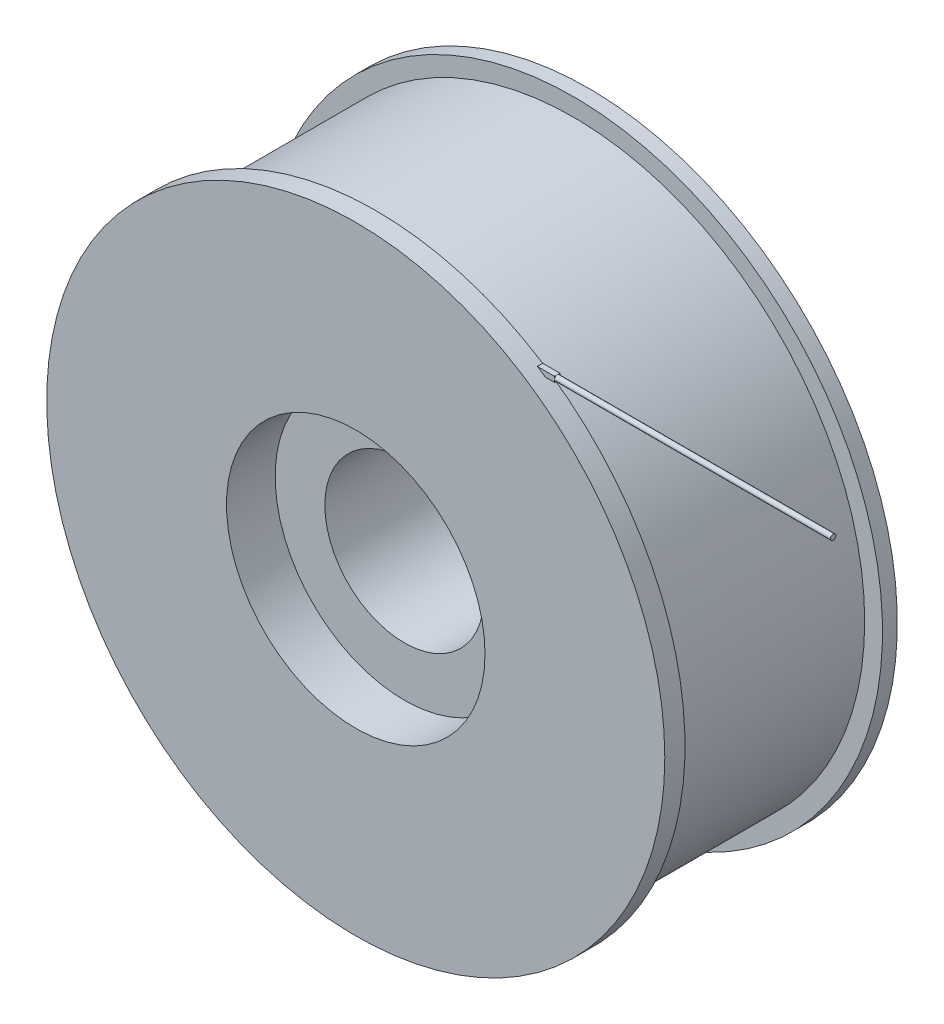
ISO-10303-21;
HEADER;
FILE_DESCRIPTION(('STEP AP214'),'2;1');
FILE_NAME('part.step','',(''),(''),'','','');
FILE_SCHEMA(('AUTOMOTIVE_DESIGN { 1 0 10303 214 1 1 1 1 }'));
ENDSEC;
DATA;
#1=APPLICATION_CONTEXT('core data for automotive mechanical design processes');
#2=APPLICATION_PROTOCOL_DEFINITION('international standard','automotive_design',2000,#1);
#3=PRODUCT_CONTEXT('',#1,'mechanical');
#4=PRODUCT('Part','Part','',(#3));
#5=PRODUCT_RELATED_PRODUCT_CATEGORY('part','',(#4));
#6=PRODUCT_DEFINITION_FORMATION('','',#4);
#7=PRODUCT_DEFINITION_CONTEXT('part definition',#1,'design');
#8=PRODUCT_DEFINITION('design','',#6,#7);
#9=PRODUCT_DEFINITION_SHAPE('','',#8);
#10=(LENGTH_UNIT() NAMED_UNIT(*) SI_UNIT(.MILLI.,.METRE.));
#11=(NAMED_UNIT(*) PLANE_ANGLE_UNIT() SI_UNIT($,.RADIAN.));
#12=(NAMED_UNIT(*) SI_UNIT($,.STERADIAN.) SOLID_ANGLE_UNIT());
#13=UNCERTAINTY_MEASURE_WITH_UNIT(LENGTH_MEASURE(1.E-05),#10,'distance_accuracy_value','');
#14=(GEOMETRIC_REPRESENTATION_CONTEXT(3) GLOBAL_UNCERTAINTY_ASSIGNED_CONTEXT((#13)) GLOBAL_UNIT_ASSIGNED_CONTEXT((#10,
#11,#12)) REPRESENTATION_CONTEXT('',''));
#15=CARTESIAN_POINT('',(0.,0.,0.));
#16=DIRECTION('',(0.,0.,1.));
#17=DIRECTION('',(1.,0.,0.));
#18=AXIS2_PLACEMENT_3D('',#15,#16,#17);
#19=CARTESIAN_POINT('',(-236.379864015801,83.12,69.26));
#20=DIRECTION('',(0.,-1.,0.));
#21=DIRECTION('',(0.,0.,-1.));
#22=AXIS2_PLACEMENT_3D('',#19,#20,#21);
#23=PLANE('',#22);
#24=DIRECTION('',(1.,0.,0.));
#25=VECTOR('',#24,1.);
#26=CARTESIAN_POINT('',(-236.379864015801,83.12,69.26));
#27=LINE('',#26,#25);
#28=CARTESIAN_POINT('',(57.0237283944149,83.12,69.26));
#29=VERTEX_POINT('',#28);
#30=CARTESIAN_POINT('',(60.0000000000001,83.12,69.26));
#31=VERTEX_POINT('',#30);
#32=EDGE_CURVE('E124',#29,#31,#27,.T.);
#33=ORIENTED_EDGE('',*,*,#32,.T.);
#34=DIRECTION('',(0.,0.,1.));
#35=VECTOR('',#34,1.);
#36=CARTESIAN_POINT('',(60.0000000000001,83.12,69.26));
#37=LINE('',#36,#35);
#38=CARTESIAN_POINT('',(60.,83.12,70.135));
#39=VERTEX_POINT('',#38);
#40=EDGE_CURVE('E148',#31,#39,#37,.T.);
#41=ORIENTED_EDGE('',*,*,#40,.T.);
#42=CARTESIAN_POINT('',(60.0000000000001,83.12,71.01));
#43=VERTEX_POINT('',#42);
#44=EDGE_CURVE('E140',#39,#43,#37,.T.);
#45=ORIENTED_EDGE('',*,*,#44,.T.);
#46=DIRECTION('',(1.,0.,0.));
#47=VECTOR('',#46,1.);
#48=CARTESIAN_POINT('',(-236.379864015801,83.12,71.01));
#49=LINE('',#48,#47);
#50=CARTESIAN_POINT('',(57.0237283944149,83.12,71.01));
#51=VERTEX_POINT('',#50);
#52=EDGE_CURVE('E128',#51,#43,#49,.T.);
#53=ORIENTED_EDGE('',*,*,#52,.F.);
#54=DIRECTION('',(0.,0.,1.));
#55=VECTOR('',#54,1.);
#56=CARTESIAN_POINT('',(57.0237283944149,83.12,69.26));
#57=LINE('',#56,#55);
#58=EDGE_CURVE('E115',#29,#51,#57,.T.);
#59=ORIENTED_EDGE('',*,*,#58,.F.);
#60=EDGE_LOOP('',(#33,#41,#45,#53,#59));
#61=FACE_BOUND('',#60,.T.);
#62=ADVANCED_FACE('F71',(#61),#23,.T.);
#63=CARTESIAN_POINT('',(-236.379864015801,84.87,69.26));
#64=DIRECTION('',(0.,-1.,0.));
#65=DIRECTION('',(0.,0.,-1.));
#66=AXIS2_PLACEMENT_3D('',#63,#64,#65);
#67=PLANE('',#66);
#68=DIRECTION('',(0.,0.,1.));
#69=VECTOR('',#68,1.);
#70=CARTESIAN_POINT('',(60.0000000000001,84.87,69.26));
#71=LINE('',#70,#69);
#72=CARTESIAN_POINT('',(60.0000000000001,84.87,69.26));
#73=VERTEX_POINT('',#72);
#74=CARTESIAN_POINT('',(60.,84.87,70.135));
#75=VERTEX_POINT('',#74);
#76=EDGE_CURVE('E149',#73,#75,#71,.T.);
#77=ORIENTED_EDGE('',*,*,#76,.F.);
#78=DIRECTION('',(1.,0.,0.));
#79=VECTOR('',#78,1.);
#80=CARTESIAN_POINT('',(-236.379864015801,84.87,69.26));
#81=LINE('',#80,#79);
#82=CARTESIAN_POINT('',(54.3849528822082,84.87,69.26));
#83=VERTEX_POINT('',#82);
#84=EDGE_CURVE('E113',#83,#73,#81,.T.);
#85=ORIENTED_EDGE('',*,*,#84,.F.);
#86=DIRECTION('',(0.,0.,1.));
#87=VECTOR('',#86,1.);
#88=CARTESIAN_POINT('',(54.3849528822082,84.87,69.26));
#89=LINE('',#88,#87);
#90=CARTESIAN_POINT('',(54.3849528822082,84.87,71.01));
#91=VERTEX_POINT('',#90);
#92=EDGE_CURVE('E94',#83,#91,#89,.T.);
#93=ORIENTED_EDGE('',*,*,#92,.T.);
#94=DIRECTION('',(1.,0.,0.));
#95=VECTOR('',#94,1.);
#96=CARTESIAN_POINT('',(-236.379864015801,84.87,71.01));
#97=LINE('',#96,#95);
#98=CARTESIAN_POINT('',(60.0000000000001,84.87,71.01));
#99=VERTEX_POINT('',#98);
#100=EDGE_CURVE('E111',#91,#99,#97,.T.);
#101=ORIENTED_EDGE('',*,*,#100,.T.);
#102=EDGE_CURVE('E153',#75,#99,#71,.T.);
#103=ORIENTED_EDGE('',*,*,#102,.F.);
#104=EDGE_LOOP('',(#77,#85,#93,#101,#103));
#105=FACE_BOUND('',#104,.T.);
#106=ADVANCED_FACE('F108',(#105),#67,.F.);
#107=CARTESIAN_POINT('',(-236.379864015801,10.8271208898592,69.26));
#108=DIRECTION('',(0.,0.,-1.));
#109=DIRECTION('',(-1.,0.,0.));
#110=AXIS2_PLACEMENT_3D('',#107,#108,#109);
#111=PLANE('',#110);
#112=ORIENTED_EDGE('',*,*,#84,.T.);
#113=DIRECTION('',(0.,-1.,0.));
#114=VECTOR('',#113,1.);
#115=CARTESIAN_POINT('',(60.0000000000001,10.8271208898592,69.26));
#116=LINE('',#115,#114);
#117=CARTESIAN_POINT('',(60.,83.995,69.26));
#118=VERTEX_POINT('',#117);
#119=EDGE_CURVE('E130',#73,#118,#116,.T.);
#120=ORIENTED_EDGE('',*,*,#119,.T.);
#121=EDGE_CURVE('E151',#118,#31,#116,.T.);
#122=ORIENTED_EDGE('',*,*,#121,.T.);
#123=ORIENTED_EDGE('',*,*,#32,.F.);
#124=CARTESIAN_POINT('',(0.,0.,69.26));
#125=DIRECTION('',(0.,0.,-1.));
#126=DIRECTION('',(-1.,0.,0.));
#127=AXIS2_PLACEMENT_3D('',#124,#125,#126);
#128=CIRCLE('',#127,100.8);
#129=EDGE_CURVE('E160',#83,#29,#128,.T.);
#130=ORIENTED_EDGE('',*,*,#129,.F.);
#131=EDGE_LOOP('',(#112,#120,#122,#123,#130));
#132=FACE_BOUND('',#131,.T.);
#133=ADVANCED_FACE('F164',(#132),#111,.T.);
#134=CARTESIAN_POINT('',(-236.379864015801,10.8271208898592,71.01));
#135=DIRECTION('',(0.,0.,-1.));
#136=DIRECTION('',(-1.,0.,0.));
#137=AXIS2_PLACEMENT_3D('',#134,#135,#136);
#138=PLANE('',#137);
#139=DIRECTION('',(0.,-1.,0.));
#140=VECTOR('',#139,1.);
#141=CARTESIAN_POINT('',(60.0000000000001,10.8271208898592,71.01));
#142=LINE('',#141,#140);
#143=CARTESIAN_POINT('',(60.,83.995,71.01));
#144=VERTEX_POINT('',#143);
#145=EDGE_CURVE('E13',#99,#144,#142,.T.);
#146=ORIENTED_EDGE('',*,*,#145,.F.);
#147=ORIENTED_EDGE('',*,*,#100,.F.);
#148=CARTESIAN_POINT('',(0.,0.,71.01));
#149=DIRECTION('',(0.,0.,-1.));
#150=DIRECTION('',(-1.,0.,0.));
#151=AXIS2_PLACEMENT_3D('',#148,#149,#150);
#152=CIRCLE('',#151,100.8);
#153=EDGE_CURVE('E122',#91,#51,#152,.T.);
#154=ORIENTED_EDGE('',*,*,#153,.T.);
#155=ORIENTED_EDGE('',*,*,#52,.T.);
#156=EDGE_CURVE('E74',#144,#43,#142,.T.);
#157=ORIENTED_EDGE('',*,*,#156,.F.);
#158=EDGE_LOOP('',(#146,#147,#154,#155,#157));
#159=FACE_BOUND('',#158,.T.);
#160=ADVANCED_FACE('F120',(#159),#138,.F.);
#161=CARTESIAN_POINT('',(0.,0.,69.26));
#162=DIRECTION('',(0.,0.,1.));
#163=DIRECTION('',(1.,0.,0.));
#164=AXIS2_PLACEMENT_3D('',#161,#162,#163);
#165=CYLINDRICAL_SURFACE('',#164,100.8);
#166=ORIENTED_EDGE('',*,*,#153,.F.);
#167=ORIENTED_EDGE('',*,*,#92,.F.);
#168=ORIENTED_EDGE('',*,*,#129,.T.);
#169=ORIENTED_EDGE('',*,*,#58,.T.);
#170=EDGE_LOOP('',(#166,#167,#168,#169));
#171=FACE_BOUND('',#170,.T.);
#172=ADVANCED_FACE('F126',(#171),#165,.F.);
#173=CARTESIAN_POINT('',(60.,83.995,70.135));
#174=DIRECTION('',(1.,0.,0.));
#175=DIRECTION('',(0.,0.,-1.));
#176=AXIS2_PLACEMENT_3D('',#173,#174,#175);
#177=CYLINDRICAL_SURFACE('',#176,0.875000000000005);
#178=CARTESIAN_POINT('',(150.,83.995,70.135));
#179=DIRECTION('',(1.,0.,0.));
#180=DIRECTION('',(0.,0.,-1.));
#181=AXIS2_PLACEMENT_3D('',#178,#179,#180);
#182=CIRCLE('',#181,0.875000000000005);
#183=CARTESIAN_POINT('',(150.,83.995,69.26));
#184=VERTEX_POINT('',#183);
#185=EDGE_CURVE('E184',#184,#184,#182,.T.);
#186=ORIENTED_EDGE('',*,*,#185,.F.);
#187=EDGE_LOOP('',(#186));
#188=FACE_BOUND('',#187,.T.);
#189=CARTESIAN_POINT('',(60.,83.995,70.135));
#190=DIRECTION('',(1.,0.,0.));
#191=DIRECTION('',(0.,0.,-1.));
#192=AXIS2_PLACEMENT_3D('',#189,#190,#191);
#193=CIRCLE('',#192,0.875000000000005);
#194=EDGE_CURVE('E142',#144,#39,#193,.T.);
#195=ORIENTED_EDGE('',*,*,#194,.T.);
#196=EDGE_CURVE('E181',#39,#118,#193,.T.);
#197=ORIENTED_EDGE('',*,*,#196,.T.);
#198=EDGE_CURVE('E183',#118,#75,#193,.T.);
#199=ORIENTED_EDGE('',*,*,#198,.T.);
#200=EDGE_CURVE('E85',#75,#144,#193,.T.);
#201=ORIENTED_EDGE('',*,*,#200,.T.);
#202=EDGE_LOOP('',(#195,#197,#199,#201));
#203=FACE_BOUND('',#202,.T.);
#204=ADVANCED_FACE('F182',(#188,#203),#177,.T.);
#205=CARTESIAN_POINT('',(60.,83.995,67.845217101876));
#206=DIRECTION('',(1.,0.,0.));
#207=DIRECTION('',(0.,0.,-1.));
#208=AXIS2_PLACEMENT_3D('',#205,#206,#207);
#209=PLANE('',#208);
#210=ORIENTED_EDGE('',*,*,#76,.T.);
#211=ORIENTED_EDGE('',*,*,#198,.F.);
#212=ORIENTED_EDGE('',*,*,#119,.F.);
#213=EDGE_LOOP('',(#210,#211,#212));
#214=FACE_BOUND('',#213,.T.);
#215=ADVANCED_FACE('F186',(#214),#209,.T.);
#216=ORIENTED_EDGE('',*,*,#196,.F.);
#217=ORIENTED_EDGE('',*,*,#40,.F.);
#218=ORIENTED_EDGE('',*,*,#121,.F.);
#219=EDGE_LOOP('',(#216,#217,#218));
#220=FACE_BOUND('',#219,.T.);
#221=ADVANCED_FACE('F180',(#220),#209,.T.);
#222=ORIENTED_EDGE('',*,*,#102,.T.);
#223=ORIENTED_EDGE('',*,*,#145,.T.);
#224=ORIENTED_EDGE('',*,*,#200,.F.);
#225=EDGE_LOOP('',(#222,#223,#224));
#226=FACE_BOUND('',#225,.T.);
#227=ADVANCED_FACE('F253',(#226),#209,.T.);
#228=ORIENTED_EDGE('',*,*,#194,.F.);
#229=ORIENTED_EDGE('',*,*,#156,.T.);
#230=ORIENTED_EDGE('',*,*,#44,.F.);
#231=EDGE_LOOP('',(#228,#229,#230));
#232=FACE_BOUND('',#231,.T.);
#233=ADVANCED_FACE('F138',(#232),#209,.T.);
#234=CARTESIAN_POINT('',(150.,10.8271208898592,69.26));
#235=DIRECTION('',(-1.,0.,0.));
#236=DIRECTION('',(0.,0.,1.));
#237=AXIS2_PLACEMENT_3D('',#234,#235,#236);
#238=PLANE('',#237);
#239=ORIENTED_EDGE('',*,*,#185,.T.);
#240=EDGE_LOOP('',(#239));
#241=FACE_BOUND('',#240,.T.);
#242=ADVANCED_FACE('F190',(#241),#238,.F.);
#243=CLOSED_SHELL('',(#62,#106,#133,#160,#172,#204,#215,#221,#227,#233,#242));
#244=MANIFOLD_SOLID_BREP('B2',#243);
#245=CARTESIAN_POINT('',(0.,0.,71.01));
#246=DIRECTION('',(0.,0.,1.));
#247=DIRECTION('',(1.,0.,0.));
#248=AXIS2_PLACEMENT_3D('',#245,#246,#247);
#249=PLANE('',#248);
#250=DIRECTION('',(1.,0.,0.));
#251=VECTOR('',#250,1.);
#252=CARTESIAN_POINT('',(-236.379864015801,83.12,71.01));
#253=LINE('',#252,#251);
#254=CARTESIAN_POINT('',(46.0007130379519,83.12,71.01));
#255=VERTEX_POINT('',#254);
#256=CARTESIAN_POINT('',(57.0237283944149,83.12,71.01));
#257=VERTEX_POINT('',#256);
#258=EDGE_CURVE('E449',#255,#257,#253,.T.);
#259=ORIENTED_EDGE('',*,*,#258,.F.);
#260=CARTESIAN_POINT('',(0.,0.,71.01));
#261=DIRECTION('',(0.,0.,1.));
#262=DIRECTION('',(1.,0.,0.));
#263=AXIS2_PLACEMENT_3D('',#260,#261,#262);
#264=CIRCLE('',#263,95.);
#265=CARTESIAN_POINT('',(42.6858653420544,84.87,71.01));
#266=VERTEX_POINT('',#265);
#267=EDGE_CURVE('E69',#266,#255,#264,.F.);
#268=ORIENTED_EDGE('',*,*,#267,.F.);
#269=DIRECTION('',(1.,0.,0.));
#270=VECTOR('',#269,1.);
#271=CARTESIAN_POINT('',(-236.379864015801,84.87,71.01));
#272=LINE('',#271,#270);
#273=CARTESIAN_POINT('',(54.3849528822082,84.87,71.01));
#274=VERTEX_POINT('',#273);
#275=EDGE_CURVE('E372',#266,#274,#272,.T.);
#276=ORIENTED_EDGE('',*,*,#275,.T.);
#277=CARTESIAN_POINT('',(0.,0.,71.01));
#278=DIRECTION('',(0.,0.,1.));
#279=DIRECTION('',(1.,0.,0.));
#280=AXIS2_PLACEMENT_3D('',#277,#278,#279);
#281=CIRCLE('',#280,100.8);
#282=EDGE_CURVE('E411',#257,#274,#281,.T.);
#283=ORIENTED_EDGE('',*,*,#282,.F.);
#284=EDGE_LOOP('',(#259,#268,#276,#283));
#285=FACE_BOUND('',#284,.T.);
#286=ADVANCED_FACE('F333',(#285),#249,.F.);
#287=CARTESIAN_POINT('',(0.,0.,-263.860576850888));
#288=DIRECTION('',(0.,0.,1.));
#289=DIRECTION('',(1.,0.,0.));
#290=AXIS2_PLACEMENT_3D('',#287,#288,#289);
#291=CYLINDRICAL_SURFACE('',#290,95.);
#292=CARTESIAN_POINT('',(0.,0.,4.84000000000001));
#293=DIRECTION('',(0.,0.,1.));
#294=DIRECTION('',(1.,0.,0.));
#295=AXIS2_PLACEMENT_3D('',#292,#293,#294);
#296=CIRCLE('',#295,95.);
#297=CARTESIAN_POINT('',(95.,0.,4.84000000000001));
#298=VERTEX_POINT('',#297);
#299=EDGE_CURVE('E392',#298,#298,#296,.T.);
#300=ORIENTED_EDGE('',*,*,#299,.T.);
#301=EDGE_LOOP('',(#300));
#302=FACE_BOUND('',#301,.T.);
#303=DIRECTION('',(0.,0.,1.));
#304=VECTOR('',#303,1.);
#305=CARTESIAN_POINT('',(46.0007130379519,83.12,69.26));
#306=LINE('',#305,#304);
#307=CARTESIAN_POINT('',(46.0007130379519,83.12,69.26));
#308=VERTEX_POINT('',#307);
#309=EDGE_CURVE('E380',#308,#255,#306,.T.);
#310=ORIENTED_EDGE('',*,*,#309,.F.);
#311=CARTESIAN_POINT('',(0.,0.,69.26));
#312=DIRECTION('',(0.,0.,-1.));
#313=DIRECTION('',(-1.,0.,0.));
#314=AXIS2_PLACEMENT_3D('',#311,#312,#313);
#315=CIRCLE('',#314,95.);
#316=CARTESIAN_POINT('',(42.6858653420544,84.87,69.26));
#317=VERTEX_POINT('',#316);
#318=EDGE_CURVE('E384',#317,#308,#315,.F.);
#319=ORIENTED_EDGE('',*,*,#318,.F.);
#320=DIRECTION('',(0.,0.,1.));
#321=VECTOR('',#320,1.);
#322=CARTESIAN_POINT('',(42.6858653420544,84.87,69.26));
#323=LINE('',#322,#321);
#324=EDGE_CURVE('E454',#317,#266,#323,.T.);
#325=ORIENTED_EDGE('',*,*,#324,.T.);
#326=ORIENTED_EDGE('',*,*,#267,.T.);
#327=EDGE_LOOP('',(#310,#319,#325,#326));
#328=FACE_BOUND('',#327,.T.);
#329=ADVANCED_FACE('F390',(#302,#328),#291,.T.);
#330=CARTESIAN_POINT('',(0.,0.,4.84));
#331=DIRECTION('',(0.,0.,1.));
#332=DIRECTION('',(1.,0.,0.));
#333=AXIS2_PLACEMENT_3D('',#330,#331,#332);
#334=PLANE('',#333);
#335=CARTESIAN_POINT('',(0.,0.,4.84));
#336=DIRECTION('',(0.,0.,1.));
#337=DIRECTION('',(1.,0.,0.));
#338=AXIS2_PLACEMENT_3D('',#335,#336,#337);
#339=CIRCLE('',#338,100.8);
#340=CARTESIAN_POINT('',(-100.8,0.,4.84));
#341=VERTEX_POINT('',#340);
#342=EDGE_CURVE('E341',#341,#341,#339,.T.);
#343=ORIENTED_EDGE('',*,*,#342,.T.);
#344=EDGE_LOOP('',(#343));
#345=FACE_BOUND('',#344,.T.);
#346=ORIENTED_EDGE('',*,*,#299,.F.);
#347=EDGE_LOOP('',(#346));
#348=FACE_BOUND('',#347,.T.);
#349=ADVANCED_FACE('F472',(#345,#348),#334,.T.);
#350=CARTESIAN_POINT('',(0.,0.,4.84));
#351=DIRECTION('',(0.,0.,-1.));
#352=DIRECTION('',(-1.,0.,0.));
#353=AXIS2_PLACEMENT_3D('',#350,#351,#352);
#354=CYLINDRICAL_SURFACE('',#353,25.95);
#355=CARTESIAN_POINT('',(0.,0.,0.));
#356=DIRECTION('',(0.,0.,1.));
#357=DIRECTION('',(1.,0.,0.));
#358=AXIS2_PLACEMENT_3D('',#355,#356,#357);
#359=CIRCLE('',#358,25.95);
#360=CARTESIAN_POINT('',(-25.95,0.,0.));
#361=VERTEX_POINT('',#360);
#362=EDGE_CURVE('E410',#361,#361,#359,.T.);
#363=CARTESIAN_POINT('',(0.,0.,59.99));
#364=DIRECTION('',(0.,0.,1.));
#365=DIRECTION('',(1.,0.,0.));
#366=AXIS2_PLACEMENT_3D('',#363,#364,#365);
#367=CIRCLE('',#366,25.95);
#368=CARTESIAN_POINT('',(-25.95,0.,59.99));
#369=VERTEX_POINT('',#368);
#370=EDGE_CURVE('E404',#369,#369,#367,.T.);
#371=CARTESIAN_POINT('',(-25.95,0.,0.));
#372=CARTESIAN_POINT('',(-25.95,0.,0.624895833333334));
#373=CARTESIAN_POINT('',(-25.95,0.,1.24979166666667));
#374=CARTESIAN_POINT('',(-25.95,0.,2.49958333333333));
#375=CARTESIAN_POINT('',(-25.95,0.,3.12447916666667));
#376=CARTESIAN_POINT('',(-25.95,0.,4.37427083333333));
#377=CARTESIAN_POINT('',(-25.95,0.,4.99916666666667));
#378=CARTESIAN_POINT('',(-25.95,0.,6.24895833333333));
#379=CARTESIAN_POINT('',(-25.95,0.,6.87385416666667));
#380=CARTESIAN_POINT('',(-25.95,0.,8.12364583333333));
#381=CARTESIAN_POINT('',(-25.95,0.,8.74854166666666));
#382=CARTESIAN_POINT('',(-25.95,0.,9.99833333333333));
#383=CARTESIAN_POINT('',(-25.95,0.,10.6232291666667));
#384=CARTESIAN_POINT('',(-25.95,0.,11.8730208333333));
#385=CARTESIAN_POINT('',(-25.95,0.,12.4979166666667));
#386=CARTESIAN_POINT('',(-25.95,0.,13.7477083333333));
#387=CARTESIAN_POINT('',(-25.95,0.,14.3726041666667));
#388=CARTESIAN_POINT('',(-25.95,0.,15.6223958333333));
#389=CARTESIAN_POINT('',(-25.95,0.,16.2472916666667));
#390=CARTESIAN_POINT('',(-25.95,0.,17.4970833333333));
#391=CARTESIAN_POINT('',(-25.95,0.,18.1219791666667));
#392=CARTESIAN_POINT('',(-25.95,0.,19.3717708333333));
#393=CARTESIAN_POINT('',(-25.95,0.,19.9966666666667));
#394=CARTESIAN_POINT('',(-25.95,0.,21.2464583333333));
#395=CARTESIAN_POINT('',(-25.95,0.,21.8713541666667));
#396=CARTESIAN_POINT('',(-25.95,0.,23.1211458333333));
#397=CARTESIAN_POINT('',(-25.95,0.,23.7460416666667));
#398=CARTESIAN_POINT('',(-25.95,0.,24.9958333333333));
#399=CARTESIAN_POINT('',(-25.95,0.,25.6207291666667));
#400=CARTESIAN_POINT('',(-25.95,0.,26.8705208333333));
#401=CARTESIAN_POINT('',(-25.95,0.,27.4954166666667));
#402=CARTESIAN_POINT('',(-25.95,0.,28.7452083333333));
#403=CARTESIAN_POINT('',(-25.95,0.,29.3701041666667));
#404=CARTESIAN_POINT('',(-25.95,0.,30.6198958333333));
#405=CARTESIAN_POINT('',(-25.95,0.,31.2447916666667));
#406=CARTESIAN_POINT('',(-25.95,0.,32.4945833333333));
#407=CARTESIAN_POINT('',(-25.95,0.,33.1194791666667));
#408=CARTESIAN_POINT('',(-25.95,0.,34.3692708333333));
#409=CARTESIAN_POINT('',(-25.95,0.,34.9941666666667));
#410=CARTESIAN_POINT('',(-25.95,0.,36.2439583333333));
#411=CARTESIAN_POINT('',(-25.95,0.,36.8688541666667));
#412=CARTESIAN_POINT('',(-25.95,0.,38.1186458333333));
#413=CARTESIAN_POINT('',(-25.95,0.,38.7435416666667));
#414=CARTESIAN_POINT('',(-25.95,0.,39.9933333333333));
#415=CARTESIAN_POINT('',(-25.95,0.,40.6182291666667));
#416=CARTESIAN_POINT('',(-25.95,0.,41.8680208333333));
#417=CARTESIAN_POINT('',(-25.95,0.,42.4929166666667));
#418=CARTESIAN_POINT('',(-25.95,0.,43.7427083333333));
#419=CARTESIAN_POINT('',(-25.95,0.,44.3676041666667));
#420=CARTESIAN_POINT('',(-25.95,0.,45.6173958333333));
#421=CARTESIAN_POINT('',(-25.95,0.,46.2422916666667));
#422=CARTESIAN_POINT('',(-25.95,0.,47.4920833333333));
#423=CARTESIAN_POINT('',(-25.95,0.,48.1169791666667));
#424=CARTESIAN_POINT('',(-25.95,0.,49.3667708333333));
#425=CARTESIAN_POINT('',(-25.95,0.,49.9916666666667));
#426=CARTESIAN_POINT('',(-25.95,0.,51.2414583333333));
#427=CARTESIAN_POINT('',(-25.95,0.,51.8663541666667));
#428=CARTESIAN_POINT('',(-25.95,0.,53.1161458333333));
#429=CARTESIAN_POINT('',(-25.95,0.,53.7410416666667));
#430=CARTESIAN_POINT('',(-25.95,0.,54.9908333333333));
#431=CARTESIAN_POINT('',(-25.95,0.,55.6157291666667));
#432=CARTESIAN_POINT('',(-25.95,0.,56.8655208333333));
#433=CARTESIAN_POINT('',(-25.95,0.,57.4904166666667));
#434=CARTESIAN_POINT('',(-25.95,0.,58.7402083333333));
#435=CARTESIAN_POINT('',(-25.95,0.,59.3651041666667));
#436=CARTESIAN_POINT('',(-25.95,0.,59.99));
#437=B_SPLINE_CURVE_WITH_KNOTS('',3,(#371,#372,#373,#374,#375,#376,#377,#378,#379,#380,#381,
#382,#383,#384,#385,#386,#387,#388,#389,#390,#391,#392,#393,#394,#395,#396,#397,#398,#399,#400,
#401,#402,#403,#404,#405,#406,#407,#408,#409,#410,#411,#412,#413,#414,#415,#416,#417,#418,#419,
#420,#421,#422,#423,#424,#425,#426,#427,#428,#429,#430,#431,#432,#433,#434,#435,#436),
.UNSPECIFIED.,.F.,.F.,(4,2,2,2,2,2,2,2,2,2,2,2,2,2,2,2,2,2,2,2,2,2,2,2,2,2,2,2,2,2,2,2,4),(0.,
1.8746875,3.749375,5.6240625,7.49875,9.3734375,11.248125,13.1228125,14.9975,16.8721875,
18.746875,20.6215625,22.49625,24.3709375,26.245625,28.1203125,29.995,31.8696875,33.744375,
35.6190625,37.49375,39.3684375,41.243125,43.1178125,44.9925,46.8671875,48.741875,50.6165625,
52.49125,54.3659375,56.240625,58.1153125,59.99),.UNSPECIFIED.);
#438=EDGE_CURVE('BSEAM423',#361,#369,#437,.T.);
#439=ORIENTED_EDGE('',*,*,#362,.F.);
#440=ORIENTED_EDGE('',*,*,#370,.T.);
#441=ORIENTED_EDGE('',*,*,#438,.T.);
#442=ORIENTED_EDGE('',*,*,#438,.F.);
#443=EDGE_LOOP('',(#439,#441,#440,#442));
#444=FACE_BOUND('',#443,.T.);
#445=ADVANCED_FACE('F423',(#444),#354,.F.);
#446=CARTESIAN_POINT('',(0.,0.,0.));
#447=DIRECTION('',(0.,0.,1.));
#448=DIRECTION('',(1.,0.,0.));
#449=AXIS2_PLACEMENT_3D('',#446,#447,#448);
#450=PLANE('',#449);
#451=CARTESIAN_POINT('',(0.,0.,0.));
#452=DIRECTION('',(0.,0.,1.));
#453=DIRECTION('',(1.,0.,0.));
#454=AXIS2_PLACEMENT_3D('',#451,#452,#453);
#455=CIRCLE('',#454,100.8);
#456=CARTESIAN_POINT('',(-100.8,0.,0.));
#457=VERTEX_POINT('',#456);
#458=EDGE_CURVE('E416',#457,#457,#455,.T.);
#459=ORIENTED_EDGE('',*,*,#458,.F.);
#460=EDGE_LOOP('',(#459));
#461=FACE_BOUND('',#460,.T.);
#462=ORIENTED_EDGE('',*,*,#362,.T.);
#463=EDGE_LOOP('',(#462));
#464=FACE_BOUND('',#463,.T.);
#465=ADVANCED_FACE('F478',(#461,#464),#450,.F.);
#466=CARTESIAN_POINT('',(0.,0.,4.84));
#467=DIRECTION('',(0.,0.,-1.));
#468=DIRECTION('',(-1.,0.,0.));
#469=AXIS2_PLACEMENT_3D('',#466,#467,#468);
#470=CYLINDRICAL_SURFACE('',#469,100.8);
#471=CARTESIAN_POINT('',(-100.8,0.,4.84));
#472=CARTESIAN_POINT('',(-100.8,0.,4.78958333333333));
#473=CARTESIAN_POINT('',(-100.8,0.,4.73916666666667));
#474=CARTESIAN_POINT('',(-100.8,0.,4.63833333333333));
#475=CARTESIAN_POINT('',(-100.8,0.,4.58791666666667));
#476=CARTESIAN_POINT('',(-100.8,0.,4.48708333333333));
#477=CARTESIAN_POINT('',(-100.8,0.,4.43666666666667));
#478=CARTESIAN_POINT('',(-100.8,0.,4.33583333333333));
#479=CARTESIAN_POINT('',(-100.8,0.,4.28541666666667));
#480=CARTESIAN_POINT('',(-100.8,0.,4.18458333333333));
#481=CARTESIAN_POINT('',(-100.8,0.,4.13416666666667));
#482=CARTESIAN_POINT('',(-100.8,0.,4.03333333333333));
#483=CARTESIAN_POINT('',(-100.8,0.,3.98291666666667));
#484=CARTESIAN_POINT('',(-100.8,0.,3.88208333333333));
#485=CARTESIAN_POINT('',(-100.8,0.,3.83166666666667));
#486=CARTESIAN_POINT('',(-100.8,0.,3.73083333333333));
#487=CARTESIAN_POINT('',(-100.8,0.,3.68041666666667));
#488=CARTESIAN_POINT('',(-100.8,0.,3.57958333333333));
#489=CARTESIAN_POINT('',(-100.8,0.,3.52916666666667));
#490=CARTESIAN_POINT('',(-100.8,0.,3.42833333333333));
#491=CARTESIAN_POINT('',(-100.8,0.,3.37791666666667));
#492=CARTESIAN_POINT('',(-100.8,0.,3.27708333333333));
#493=CARTESIAN_POINT('',(-100.8,0.,3.22666666666667));
#494=CARTESIAN_POINT('',(-100.8,0.,3.12583333333333));
#495=CARTESIAN_POINT('',(-100.8,0.,3.07541666666667));
#496=CARTESIAN_POINT('',(-100.8,0.,2.97458333333333));
#497=CARTESIAN_POINT('',(-100.8,0.,2.92416666666667));
#498=CARTESIAN_POINT('',(-100.8,0.,2.82333333333333));
#499=CARTESIAN_POINT('',(-100.8,0.,2.77291666666667));
#500=CARTESIAN_POINT('',(-100.8,0.,2.67208333333333));
#501=CARTESIAN_POINT('',(-100.8,0.,2.62166666666667));
#502=CARTESIAN_POINT('',(-100.8,0.,2.52083333333333));
#503=CARTESIAN_POINT('',(-100.8,0.,2.47041666666667));
#504=CARTESIAN_POINT('',(-100.8,0.,2.36958333333333));
#505=CARTESIAN_POINT('',(-100.8,0.,2.31916666666667));
#506=CARTESIAN_POINT('',(-100.8,0.,2.21833333333333));
#507=CARTESIAN_POINT('',(-100.8,0.,2.16791666666667));
#508=CARTESIAN_POINT('',(-100.8,0.,2.06708333333333));
#509=CARTESIAN_POINT('',(-100.8,0.,2.01666666666667));
#510=CARTESIAN_POINT('',(-100.8,0.,1.91583333333333));
#511=CARTESIAN_POINT('',(-100.8,0.,1.86541666666667));
#512=CARTESIAN_POINT('',(-100.8,0.,1.76458333333333));
#513=CARTESIAN_POINT('',(-100.8,0.,1.71416666666667));
#514=CARTESIAN_POINT('',(-100.8,0.,1.61333333333333));
#515=CARTESIAN_POINT('',(-100.8,0.,1.56291666666667));
#516=CARTESIAN_POINT('',(-100.8,0.,1.46208333333333));
#517=CARTESIAN_POINT('',(-100.8,0.,1.41166666666667));
#518=CARTESIAN_POINT('',(-100.8,0.,1.31083333333333));
#519=CARTESIAN_POINT('',(-100.8,0.,1.26041666666667));
#520=CARTESIAN_POINT('',(-100.8,0.,1.15958333333333));
#521=CARTESIAN_POINT('',(-100.8,0.,1.10916666666667));
#522=CARTESIAN_POINT('',(-100.8,0.,1.00833333333333));
#523=CARTESIAN_POINT('',(-100.8,0.,0.957916666666667));
#524=CARTESIAN_POINT('',(-100.8,0.,0.857083333333334));
#525=CARTESIAN_POINT('',(-100.8,0.,0.806666666666667));
#526=CARTESIAN_POINT('',(-100.8,0.,0.705833333333333));
#527=CARTESIAN_POINT('',(-100.8,0.,0.655416666666666));
#528=CARTESIAN_POINT('',(-100.8,0.,0.554583333333333));
#529=CARTESIAN_POINT('',(-100.8,0.,0.504166666666667));
#530=CARTESIAN_POINT('',(-100.8,0.,0.403333333333333));
#531=CARTESIAN_POINT('',(-100.8,0.,0.352916666666667));
#532=CARTESIAN_POINT('',(-100.8,0.,0.252083333333333));
#533=CARTESIAN_POINT('',(-100.8,0.,0.201666666666667));
#534=CARTESIAN_POINT('',(-100.8,0.,0.100833333333334));
#535=CARTESIAN_POINT('',(-100.8,0.,0.0504166666666667));
#536=CARTESIAN_POINT('',(-100.8,0.,0.));
#537=B_SPLINE_CURVE_WITH_KNOTS('',3,(#471,#472,#473,#474,#475,#476,#477,#478,#479,#480,#481,
#482,#483,#484,#485,#486,#487,#488,#489,#490,#491,#492,#493,#494,#495,#496,#497,#498,#499,#500,
#501,#502,#503,#504,#505,#506,#507,#508,#509,#510,#511,#512,#513,#514,#515,#516,#517,#518,#519,
#520,#521,#522,#523,#524,#525,#526,#527,#528,#529,#530,#531,#532,#533,#534,#535,#536),
.UNSPECIFIED.,.F.,.F.,(4,2,2,2,2,2,2,2,2,2,2,2,2,2,2,2,2,2,2,2,2,2,2,2,2,2,2,2,2,2,2,2,4),(0.,
0.151249999999999,0.3025,0.453749999999999,0.605,0.756249999999999,0.907499999999999,1.05875,
1.21,1.36125,1.5125,1.66375,1.815,1.96625,2.1175,2.26875,2.42,2.57125,2.7225,2.87375,3.025,
3.17625,3.3275,3.47875,3.63,3.78125,3.9325,4.08375,4.235,4.38625,4.5375,4.68875,4.84),.UNSPECIFIED.);
#538=EDGE_CURVE('BSEAM335',#341,#457,#537,.T.);
#539=ORIENTED_EDGE('',*,*,#342,.F.);
#540=ORIENTED_EDGE('',*,*,#458,.T.);
#541=ORIENTED_EDGE('',*,*,#538,.T.);
#542=ORIENTED_EDGE('',*,*,#538,.F.);
#543=EDGE_LOOP('',(#539,#541,#540,#542));
#544=FACE_BOUND('',#543,.T.);
#545=ADVANCED_FACE('F335',(#544),#470,.T.);
#546=CARTESIAN_POINT('',(0.,0.,75.85));
#547=DIRECTION('',(0.,0.,1.));
#548=DIRECTION('',(1.,0.,0.));
#549=AXIS2_PLACEMENT_3D('',#546,#547,#548);
#550=PLANE('',#549);
#551=CARTESIAN_POINT('',(0.,0.,75.85));
#552=DIRECTION('',(0.,0.,1.));
#553=DIRECTION('',(1.,0.,0.));
#554=AXIS2_PLACEMENT_3D('',#551,#552,#553);
#555=CIRCLE('',#554,42.16);
#556=CARTESIAN_POINT('',(42.16,0.,75.85));
#557=VERTEX_POINT('',#556);
#558=EDGE_CURVE('E395',#557,#557,#555,.T.);
#559=ORIENTED_EDGE('',*,*,#558,.F.);
#560=EDGE_LOOP('',(#559));
#561=FACE_BOUND('',#560,.T.);
#562=CARTESIAN_POINT('',(0.,0.,75.85));
#563=DIRECTION('',(0.,0.,1.));
#564=DIRECTION('',(1.,0.,0.));
#565=AXIS2_PLACEMENT_3D('',#562,#563,#564);
#566=CIRCLE('',#565,100.8);
#567=CARTESIAN_POINT('',(100.8,0.,75.85));
#568=VERTEX_POINT('',#567);
#569=EDGE_CURVE('E407',#568,#568,#566,.T.);
#570=ORIENTED_EDGE('',*,*,#569,.T.);
#571=EDGE_LOOP('',(#570));
#572=FACE_BOUND('',#571,.T.);
#573=ADVANCED_FACE('F438',(#561,#572),#550,.T.);
#574=CARTESIAN_POINT('',(0.,0.,75.85));
#575=DIRECTION('',(0.,0.,-1.));
#576=DIRECTION('',(-1.,0.,0.));
#577=AXIS2_PLACEMENT_3D('',#574,#575,#576);
#578=CYLINDRICAL_SURFACE('',#577,100.8);
#579=ORIENTED_EDGE('',*,*,#569,.F.);
#580=EDGE_LOOP('',(#579));
#581=FACE_BOUND('',#580,.T.);
#582=ORIENTED_EDGE('',*,*,#282,.T.);
#583=DIRECTION('',(0.,0.,1.));
#584=VECTOR('',#583,1.);
#585=CARTESIAN_POINT('',(54.3849528822082,84.87,69.26));
#586=LINE('',#585,#584);
#587=CARTESIAN_POINT('',(54.3849528822082,84.87,69.26));
#588=VERTEX_POINT('',#587);
#589=EDGE_CURVE('E397',#588,#274,#586,.T.);
#590=ORIENTED_EDGE('',*,*,#589,.F.);
#591=CARTESIAN_POINT('',(0.,0.,69.26));
#592=DIRECTION('',(0.,0.,-1.));
#593=DIRECTION('',(-1.,0.,0.));
#594=AXIS2_PLACEMENT_3D('',#591,#592,#593);
#595=CIRCLE('',#594,100.8);
#596=CARTESIAN_POINT('',(57.0237283944149,83.12,69.26));
#597=VERTEX_POINT('',#596);
#598=EDGE_CURVE('E354',#597,#588,#595,.T.);
#599=ORIENTED_EDGE('',*,*,#598,.F.);
#600=DIRECTION('',(0.,0.,1.));
#601=VECTOR('',#600,1.);
#602=CARTESIAN_POINT('',(57.0237283944149,83.12,69.26));
#603=LINE('',#602,#601);
#604=EDGE_CURVE('E383',#597,#257,#603,.T.);
#605=ORIENTED_EDGE('',*,*,#604,.T.);
#606=EDGE_LOOP('',(#582,#590,#599,#605));
#607=FACE_BOUND('',#606,.T.);
#608=ADVANCED_FACE('F434',(#581,#607),#578,.T.);
#609=CARTESIAN_POINT('',(0.,0.,59.99));
#610=DIRECTION('',(0.,0.,1.));
#611=DIRECTION('',(1.,0.,0.));
#612=AXIS2_PLACEMENT_3D('',#609,#610,#611);
#613=CYLINDRICAL_SURFACE('',#612,42.16);
#614=CARTESIAN_POINT('',(0.,0.,59.99));
#615=DIRECTION('',(0.,0.,1.));
#616=DIRECTION('',(1.,0.,0.));
#617=AXIS2_PLACEMENT_3D('',#614,#615,#616);
#618=CIRCLE('',#617,42.16);
#619=CARTESIAN_POINT('',(42.16,0.,59.99));
#620=VERTEX_POINT('',#619);
#621=EDGE_CURVE('E401',#620,#620,#618,.T.);
#622=ORIENTED_EDGE('',*,*,#621,.F.);
#623=EDGE_LOOP('',(#622));
#624=FACE_BOUND('',#623,.T.);
#625=ORIENTED_EDGE('',*,*,#558,.T.);
#626=EDGE_LOOP('',(#625));
#627=FACE_BOUND('',#626,.T.);
#628=ADVANCED_FACE('F428',(#624,#627),#613,.F.);
#629=CARTESIAN_POINT('',(0.,0.,59.99));
#630=DIRECTION('',(0.,0.,1.));
#631=DIRECTION('',(1.,0.,0.));
#632=AXIS2_PLACEMENT_3D('',#629,#630,#631);
#633=PLANE('',#632);
#634=ORIENTED_EDGE('',*,*,#370,.F.);
#635=EDGE_LOOP('',(#634));
#636=FACE_BOUND('',#635,.T.);
#637=ORIENTED_EDGE('',*,*,#621,.T.);
#638=EDGE_LOOP('',(#637));
#639=FACE_BOUND('',#638,.T.);
#640=ADVANCED_FACE('F425',(#636,#639),#633,.T.);
#641=CARTESIAN_POINT('',(-236.379864015801,83.12,69.26));
#642=DIRECTION('',(0.,-1.,0.));
#643=DIRECTION('',(0.,0.,-1.));
#644=AXIS2_PLACEMENT_3D('',#641,#642,#643);
#645=PLANE('',#644);
#646=ORIENTED_EDGE('',*,*,#258,.T.);
#647=ORIENTED_EDGE('',*,*,#604,.F.);
#648=DIRECTION('',(1.,0.,0.));
#649=VECTOR('',#648,1.);
#650=CARTESIAN_POINT('',(-236.379864015801,83.12,69.26));
#651=LINE('',#650,#649);
#652=EDGE_CURVE('E377',#308,#597,#651,.T.);
#653=ORIENTED_EDGE('',*,*,#652,.F.);
#654=ORIENTED_EDGE('',*,*,#309,.T.);
#655=EDGE_LOOP('',(#646,#647,#653,#654));
#656=FACE_BOUND('',#655,.T.);
#657=ADVANCED_FACE('F378',(#656),#645,.F.);
#658=CARTESIAN_POINT('',(-236.379864015801,84.87,69.26));
#659=DIRECTION('',(0.,-1.,0.));
#660=DIRECTION('',(0.,0.,-1.));
#661=AXIS2_PLACEMENT_3D('',#658,#659,#660);
#662=PLANE('',#661);
#663=ORIENTED_EDGE('',*,*,#275,.F.);
#664=ORIENTED_EDGE('',*,*,#324,.F.);
#665=DIRECTION('',(1.,0.,0.));
#666=VECTOR('',#665,1.);
#667=CARTESIAN_POINT('',(-236.379864015801,84.87,69.26));
#668=LINE('',#667,#666);
#669=EDGE_CURVE('E348',#317,#588,#668,.T.);
#670=ORIENTED_EDGE('',*,*,#669,.T.);
#671=ORIENTED_EDGE('',*,*,#589,.T.);
#672=EDGE_LOOP('',(#663,#664,#670,#671));
#673=FACE_BOUND('',#672,.T.);
#674=ADVANCED_FACE('F455',(#673),#662,.T.);
#675=CARTESIAN_POINT('',(-236.379864015801,10.8271208898592,69.26));
#676=DIRECTION('',(0.,0.,-1.));
#677=DIRECTION('',(-1.,0.,0.));
#678=AXIS2_PLACEMENT_3D('',#675,#676,#677);
#679=PLANE('',#678);
#680=ORIENTED_EDGE('',*,*,#318,.T.);
#681=ORIENTED_EDGE('',*,*,#652,.T.);
#682=ORIENTED_EDGE('',*,*,#598,.T.);
#683=ORIENTED_EDGE('',*,*,#669,.F.);
#684=EDGE_LOOP('',(#680,#681,#682,#683));
#685=FACE_BOUND('',#684,.T.);
#686=ADVANCED_FACE('F387',(#685),#679,.T.);
#687=CLOSED_SHELL('',(#286,#329,#349,#445,#465,#545,#573,#608,#628,#640,#657,#674,#686));
#688=MANIFOLD_SOLID_BREP('B7',#687);
#689=ADVANCED_BREP_SHAPE_REPRESENTATION('',(#18,#244,#688),#14);
#690=SHAPE_DEFINITION_REPRESENTATION(#9,#689);
ENDSEC;
END-ISO-10303-21;
